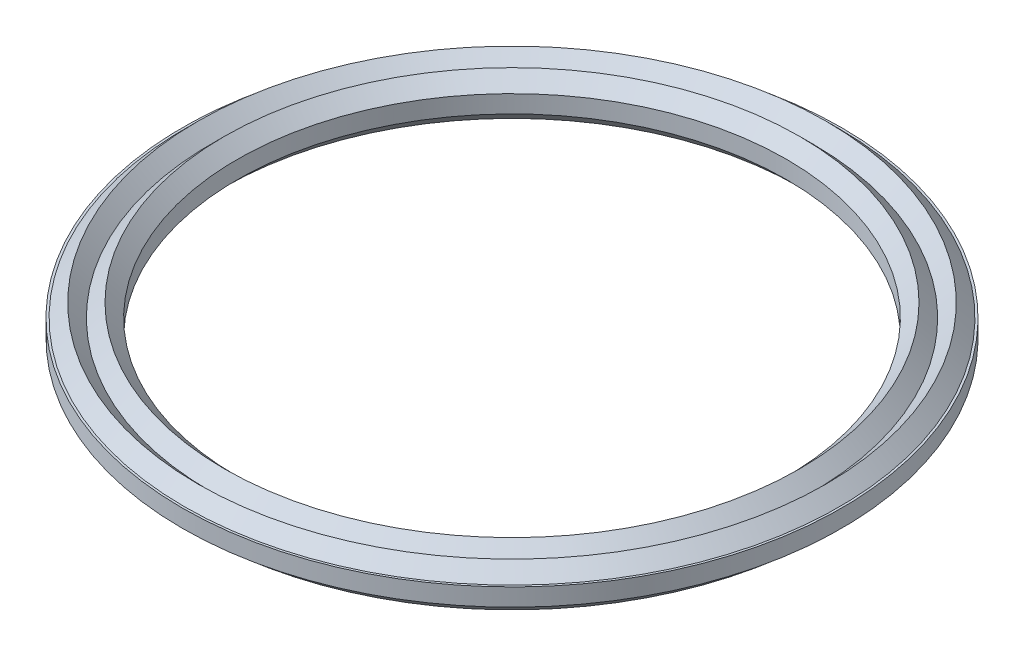
ISO-10303-21;
HEADER;
FILE_DESCRIPTION(('STEP AP214'),'2;1');
FILE_NAME('part.step','',(''),(''),'','','');
FILE_SCHEMA(('AUTOMOTIVE_DESIGN { 1 0 10303 214 1 1 1 1 }'));
ENDSEC;
DATA;
#1=APPLICATION_CONTEXT('core data for automotive mechanical design processes');
#2=APPLICATION_PROTOCOL_DEFINITION('international standard','automotive_design',2000,#1);
#3=PRODUCT_CONTEXT('',#1,'mechanical');
#4=PRODUCT('Part','Part','',(#3));
#5=PRODUCT_RELATED_PRODUCT_CATEGORY('part','',(#4));
#6=PRODUCT_DEFINITION_FORMATION('','',#4);
#7=PRODUCT_DEFINITION_CONTEXT('part definition',#1,'design');
#8=PRODUCT_DEFINITION('design','',#6,#7);
#9=PRODUCT_DEFINITION_SHAPE('','',#8);
#10=(LENGTH_UNIT() NAMED_UNIT(*) SI_UNIT(.MILLI.,.METRE.));
#11=(NAMED_UNIT(*) PLANE_ANGLE_UNIT() SI_UNIT($,.RADIAN.));
#12=(NAMED_UNIT(*) SI_UNIT($,.STERADIAN.) SOLID_ANGLE_UNIT());
#13=UNCERTAINTY_MEASURE_WITH_UNIT(LENGTH_MEASURE(1.E-05),#10,'distance_accuracy_value','');
#14=(GEOMETRIC_REPRESENTATION_CONTEXT(3) GLOBAL_UNCERTAINTY_ASSIGNED_CONTEXT((#13)) GLOBAL_UNIT_ASSIGNED_CONTEXT((#10,
#11,#12)) REPRESENTATION_CONTEXT('',''));
#15=CARTESIAN_POINT('',(0.,0.,0.));
#16=DIRECTION('',(0.,0.,1.));
#17=DIRECTION('',(1.,0.,0.));
#18=AXIS2_PLACEMENT_3D('',#15,#16,#17);
#19=CARTESIAN_POINT('',(0.,1.,0.));
#20=DIRECTION('',(0.,1.,0.));
#21=DIRECTION('',(0.,0.,1.));
#22=AXIS2_PLACEMENT_3D('',#19,#20,#21);
#23=CONICAL_SURFACE('',#22,13.1,0.785398163397445);
#24=CARTESIAN_POINT('',(0.,0.399999999999999,0.));
#25=DIRECTION('',(0.,-1.,0.));
#26=DIRECTION('',(0.,0.,-1.));
#27=AXIS2_PLACEMENT_3D('',#24,#25,#26);
#28=CIRCLE('',#27,12.5);
#29=CARTESIAN_POINT('',(0.,0.399999999999999,-12.5));
#30=VERTEX_POINT('',#29);
#31=EDGE_CURVE('E10',#30,#30,#28,.T.);
#32=ORIENTED_EDGE('',*,*,#31,.T.);
#33=EDGE_LOOP('',(#32));
#34=FACE_BOUND('',#33,.T.);
#35=CARTESIAN_POINT('',(0.,1.,0.));
#36=DIRECTION('',(0.,-1.,0.));
#37=DIRECTION('',(0.,0.,-1.));
#38=AXIS2_PLACEMENT_3D('',#35,#36,#37);
#39=CIRCLE('',#38,13.1);
#40=CARTESIAN_POINT('',(0.,1.,-13.1));
#41=VERTEX_POINT('',#40);
#42=EDGE_CURVE('E74',#41,#41,#39,.T.);
#43=ORIENTED_EDGE('',*,*,#42,.F.);
#44=EDGE_LOOP('',(#43));
#45=FACE_BOUND('',#44,.T.);
#46=ADVANCED_FACE('F34',(#34,#45),#23,.F.);
#47=CARTESIAN_POINT('',(0.,0.,0.));
#48=DIRECTION('',(0.,-1.,0.));
#49=DIRECTION('',(0.,0.,-1.));
#50=AXIS2_PLACEMENT_3D('',#47,#48,#49);
#51=CYLINDRICAL_SURFACE('',#50,12.5);
#52=CARTESIAN_POINT('',(0.,-0.4,0.));
#53=DIRECTION('',(0.,-1.,0.));
#54=DIRECTION('',(0.,0.,-1.));
#55=AXIS2_PLACEMENT_3D('',#52,#53,#54);
#56=CIRCLE('',#55,12.5);
#57=CARTESIAN_POINT('',(0.,-0.4,-12.5));
#58=VERTEX_POINT('',#57);
#59=EDGE_CURVE('E40',#58,#58,#56,.T.);
#60=ORIENTED_EDGE('',*,*,#59,.T.);
#61=EDGE_LOOP('',(#60));
#62=FACE_BOUND('',#61,.T.);
#63=ORIENTED_EDGE('',*,*,#31,.F.);
#64=EDGE_LOOP('',(#63));
#65=FACE_BOUND('',#64,.T.);
#66=ADVANCED_FACE('F82',(#62,#65),#51,.F.);
#67=CARTESIAN_POINT('',(0.,-0.4,0.));
#68=DIRECTION('',(0.,-1.,0.));
#69=DIRECTION('',(0.,0.,-1.));
#70=AXIS2_PLACEMENT_3D('',#67,#68,#69);
#71=CONICAL_SURFACE('',#70,12.5,0.785398163397452);
#72=CARTESIAN_POINT('',(0.,-0.999999999999999,0.));
#73=DIRECTION('',(0.,-1.,0.));
#74=DIRECTION('',(0.,0.,-1.));
#75=AXIS2_PLACEMENT_3D('',#72,#73,#74);
#76=CIRCLE('',#75,13.1);
#77=CARTESIAN_POINT('',(0.,-0.999999999999999,-13.1));
#78=VERTEX_POINT('',#77);
#79=EDGE_CURVE('E44',#78,#78,#76,.T.);
#80=ORIENTED_EDGE('',*,*,#79,.T.);
#81=EDGE_LOOP('',(#80));
#82=FACE_BOUND('',#81,.T.);
#83=ORIENTED_EDGE('',*,*,#59,.F.);
#84=EDGE_LOOP('',(#83));
#85=FACE_BOUND('',#84,.T.);
#86=ADVANCED_FACE('F86',(#82,#85),#71,.F.);
#87=CARTESIAN_POINT('',(0.,-0.999999999999999,0.));
#88=DIRECTION('',(0.,1.,0.));
#89=DIRECTION('',(0.,0.,1.));
#90=AXIS2_PLACEMENT_3D('',#87,#88,#89);
#91=CONICAL_SURFACE('',#90,13.1,0.785398163397446);
#92=CARTESIAN_POINT('',(0.,-0.4,0.));
#93=DIRECTION('',(0.,-1.,0.));
#94=DIRECTION('',(0.,0.,-1.));
#95=AXIS2_PLACEMENT_3D('',#92,#93,#94);
#96=CIRCLE('',#95,13.7);
#97=CARTESIAN_POINT('',(0.,-0.4,-13.7));
#98=VERTEX_POINT('',#97);
#99=EDGE_CURVE('E48',#98,#98,#96,.T.);
#100=ORIENTED_EDGE('',*,*,#99,.T.);
#101=EDGE_LOOP('',(#100));
#102=FACE_BOUND('',#101,.T.);
#103=ORIENTED_EDGE('',*,*,#79,.F.);
#104=EDGE_LOOP('',(#103));
#105=FACE_BOUND('',#104,.T.);
#106=ADVANCED_FACE('F90',(#102,#105),#91,.T.);
#107=CARTESIAN_POINT('',(0.,-0.4,0.));
#108=DIRECTION('',(0.,-1.,0.));
#109=DIRECTION('',(0.,0.,-1.));
#110=AXIS2_PLACEMENT_3D('',#107,#108,#109);
#111=CONICAL_SURFACE('',#110,13.7,0.785398163397443);
#112=CARTESIAN_POINT('',(0.,-1.,0.));
#113=DIRECTION('',(0.,-1.,0.));
#114=DIRECTION('',(0.,0.,-1.));
#115=AXIS2_PLACEMENT_3D('',#112,#113,#114);
#116=CIRCLE('',#115,14.3);
#117=CARTESIAN_POINT('',(0.,-1.,-14.3));
#118=VERTEX_POINT('',#117);
#119=EDGE_CURVE('E53',#118,#118,#116,.T.);
#120=ORIENTED_EDGE('',*,*,#119,.T.);
#121=EDGE_LOOP('',(#120));
#122=FACE_BOUND('',#121,.T.);
#123=ORIENTED_EDGE('',*,*,#99,.F.);
#124=EDGE_LOOP('',(#123));
#125=FACE_BOUND('',#124,.T.);
#126=ADVANCED_FACE('F97',(#122,#125),#111,.F.);
#127=CARTESIAN_POINT('',(0.,-1.,0.));
#128=DIRECTION('',(0.,1.,0.));
#129=DIRECTION('',(0.,0.,1.));
#130=AXIS2_PLACEMENT_3D('',#127,#128,#129);
#131=CONICAL_SURFACE('',#130,14.3,0.785398163397447);
#132=CARTESIAN_POINT('',(0.,-0.400000000000001,0.));
#133=DIRECTION('',(0.,-1.,0.));
#134=DIRECTION('',(0.,0.,-1.));
#135=AXIS2_PLACEMENT_3D('',#132,#133,#134);
#136=CIRCLE('',#135,14.9);
#137=CARTESIAN_POINT('',(0.,-0.400000000000001,-14.9));
#138=VERTEX_POINT('',#137);
#139=EDGE_CURVE('E56',#138,#138,#136,.T.);
#140=ORIENTED_EDGE('',*,*,#139,.T.);
#141=EDGE_LOOP('',(#140));
#142=FACE_BOUND('',#141,.T.);
#143=ORIENTED_EDGE('',*,*,#119,.F.);
#144=EDGE_LOOP('',(#143));
#145=FACE_BOUND('',#144,.T.);
#146=ADVANCED_FACE('F101',(#142,#145),#131,.T.);
#147=CARTESIAN_POINT('',(14.9,-0.400000000000001,0.));
#148=DIRECTION('',(0.,-1.,0.));
#149=DIRECTION('',(0.,0.,-1.));
#150=AXIS2_PLACEMENT_3D('',#147,#148,#149);
#151=PLANE('',#150);
#152=CARTESIAN_POINT('',(0.,-0.400000000000001,0.));
#153=DIRECTION('',(0.,-1.,0.));
#154=DIRECTION('',(0.,0.,-1.));
#155=AXIS2_PLACEMENT_3D('',#152,#153,#154);
#156=CIRCLE('',#155,15.);
#157=CARTESIAN_POINT('',(0.,-0.400000000000001,-15.));
#158=VERTEX_POINT('',#157);
#159=EDGE_CURVE('E59',#158,#158,#156,.T.);
#160=ORIENTED_EDGE('',*,*,#159,.T.);
#161=EDGE_LOOP('',(#160));
#162=FACE_BOUND('',#161,.T.);
#163=ORIENTED_EDGE('',*,*,#139,.F.);
#164=EDGE_LOOP('',(#163));
#165=FACE_BOUND('',#164,.T.);
#166=ADVANCED_FACE('F105',(#162,#165),#151,.T.);
#167=CARTESIAN_POINT('',(0.,0.,0.));
#168=DIRECTION('',(0.,-1.,0.));
#169=DIRECTION('',(0.,0.,-1.));
#170=AXIS2_PLACEMENT_3D('',#167,#168,#169);
#171=CYLINDRICAL_SURFACE('',#170,15.);
#172=CARTESIAN_POINT('',(0.,0.399999999999999,0.));
#173=DIRECTION('',(0.,-1.,0.));
#174=DIRECTION('',(0.,0.,-1.));
#175=AXIS2_PLACEMENT_3D('',#172,#173,#174);
#176=CIRCLE('',#175,15.);
#177=CARTESIAN_POINT('',(0.,0.399999999999999,-15.));
#178=VERTEX_POINT('',#177);
#179=EDGE_CURVE('E62',#178,#178,#176,.T.);
#180=ORIENTED_EDGE('',*,*,#179,.T.);
#181=EDGE_LOOP('',(#180));
#182=FACE_BOUND('',#181,.T.);
#183=ORIENTED_EDGE('',*,*,#159,.F.);
#184=EDGE_LOOP('',(#183));
#185=FACE_BOUND('',#184,.T.);
#186=ADVANCED_FACE('F109',(#182,#185),#171,.T.);
#187=CARTESIAN_POINT('',(15.,0.4,0.));
#188=DIRECTION('',(0.,1.,0.));
#189=DIRECTION('',(0.,0.,1.));
#190=AXIS2_PLACEMENT_3D('',#187,#188,#189);
#191=PLANE('',#190);
#192=CARTESIAN_POINT('',(0.,0.400000000000001,0.));
#193=DIRECTION('',(0.,-1.,0.));
#194=DIRECTION('',(0.,0.,-1.));
#195=AXIS2_PLACEMENT_3D('',#192,#193,#194);
#196=CIRCLE('',#195,14.9);
#197=CARTESIAN_POINT('',(0.,0.400000000000001,-14.9));
#198=VERTEX_POINT('',#197);
#199=EDGE_CURVE('E65',#198,#198,#196,.T.);
#200=ORIENTED_EDGE('',*,*,#199,.T.);
#201=EDGE_LOOP('',(#200));
#202=FACE_BOUND('',#201,.T.);
#203=ORIENTED_EDGE('',*,*,#179,.F.);
#204=EDGE_LOOP('',(#203));
#205=FACE_BOUND('',#204,.T.);
#206=ADVANCED_FACE('F113',(#202,#205),#191,.T.);
#207=CARTESIAN_POINT('',(0.,0.400000000000001,0.));
#208=DIRECTION('',(0.,-1.,0.));
#209=DIRECTION('',(0.,0.,-1.));
#210=AXIS2_PLACEMENT_3D('',#207,#208,#209);
#211=CONICAL_SURFACE('',#210,14.9,0.78539816339745);
#212=CARTESIAN_POINT('',(0.,0.999999999999999,0.));
#213=DIRECTION('',(0.,-1.,0.));
#214=DIRECTION('',(0.,0.,-1.));
#215=AXIS2_PLACEMENT_3D('',#212,#213,#214);
#216=CIRCLE('',#215,14.3);
#217=CARTESIAN_POINT('',(0.,0.999999999999999,-14.3));
#218=VERTEX_POINT('',#217);
#219=EDGE_CURVE('E68',#218,#218,#216,.T.);
#220=ORIENTED_EDGE('',*,*,#219,.T.);
#221=EDGE_LOOP('',(#220));
#222=FACE_BOUND('',#221,.T.);
#223=ORIENTED_EDGE('',*,*,#199,.F.);
#224=EDGE_LOOP('',(#223));
#225=FACE_BOUND('',#224,.T.);
#226=ADVANCED_FACE('F117',(#222,#225),#211,.T.);
#227=CARTESIAN_POINT('',(0.,0.999999999999999,0.));
#228=DIRECTION('',(0.,1.,0.));
#229=DIRECTION('',(0.,0.,1.));
#230=AXIS2_PLACEMENT_3D('',#227,#228,#229);
#231=CONICAL_SURFACE('',#230,14.3,0.785398163397446);
#232=CARTESIAN_POINT('',(0.,0.400000000000001,0.));
#233=DIRECTION('',(0.,-1.,0.));
#234=DIRECTION('',(0.,0.,-1.));
#235=AXIS2_PLACEMENT_3D('',#232,#233,#234);
#236=CIRCLE('',#235,13.7);
#237=CARTESIAN_POINT('',(0.,0.400000000000001,-13.7));
#238=VERTEX_POINT('',#237);
#239=EDGE_CURVE('E71',#238,#238,#236,.T.);
#240=ORIENTED_EDGE('',*,*,#239,.T.);
#241=EDGE_LOOP('',(#240));
#242=FACE_BOUND('',#241,.T.);
#243=ORIENTED_EDGE('',*,*,#219,.F.);
#244=EDGE_LOOP('',(#243));
#245=FACE_BOUND('',#244,.T.);
#246=ADVANCED_FACE('F121',(#242,#245),#231,.F.);
#247=CARTESIAN_POINT('',(0.,0.400000000000001,0.));
#248=DIRECTION('',(0.,-1.,0.));
#249=DIRECTION('',(0.,0.,-1.));
#250=AXIS2_PLACEMENT_3D('',#247,#248,#249);
#251=CONICAL_SURFACE('',#250,13.7,0.785398163397453);
#252=ORIENTED_EDGE('',*,*,#42,.T.);
#253=EDGE_LOOP('',(#252));
#254=FACE_BOUND('',#253,.T.);
#255=ORIENTED_EDGE('',*,*,#239,.F.);
#256=EDGE_LOOP('',(#255));
#257=FACE_BOUND('',#256,.T.);
#258=ADVANCED_FACE('F78',(#254,#257),#251,.T.);
#259=CLOSED_SHELL('',(#46,#66,#86,#106,#126,#146,#166,#186,#206,#226,#246,#258));
#260=MANIFOLD_SOLID_BREP('B2',#259);
#261=ADVANCED_BREP_SHAPE_REPRESENTATION('',(#18,#260),#14);
#262=SHAPE_DEFINITION_REPRESENTATION(#9,#261);
ENDSEC;
END-ISO-10303-21;
